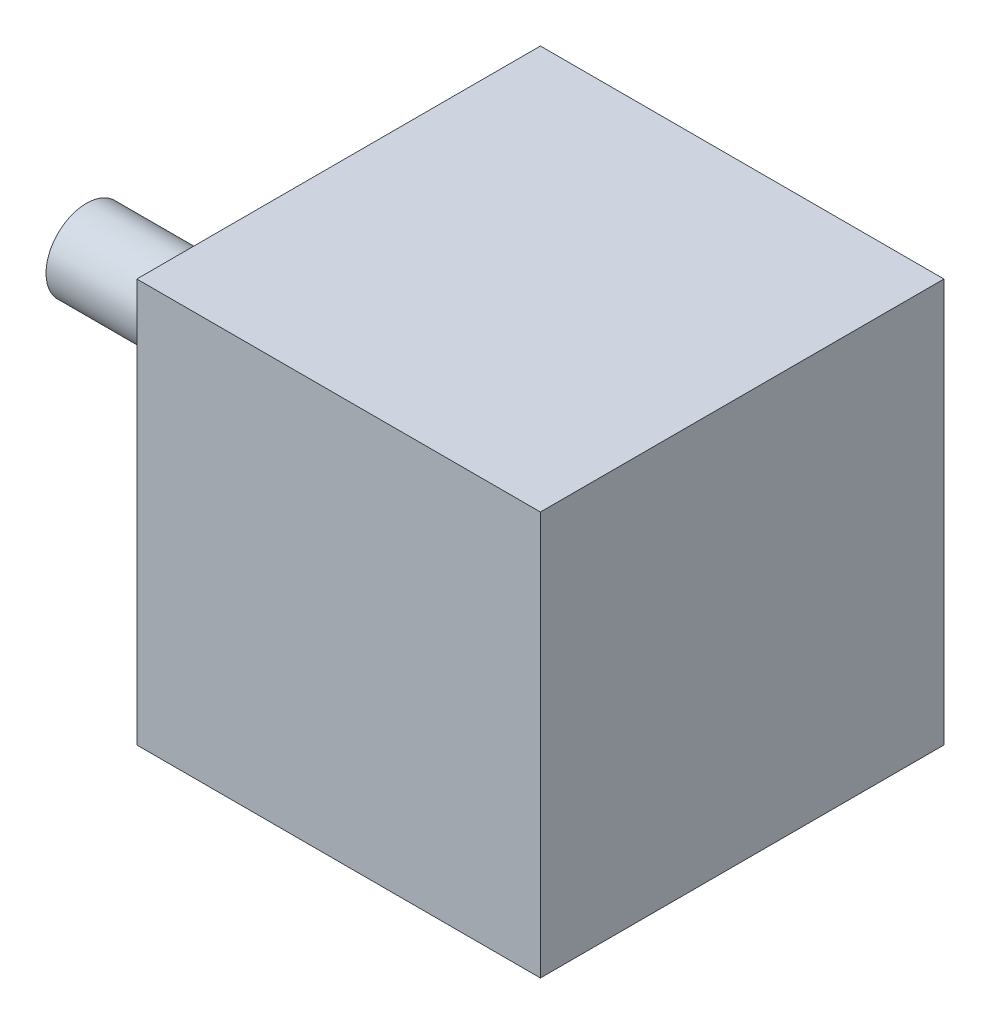
ISO-10303-21;
HEADER;
FILE_DESCRIPTION(('STEP AP214'),'2;1');
FILE_NAME('part.step','',(''),(''),'','','');
FILE_SCHEMA(('AUTOMOTIVE_DESIGN { 1 0 10303 214 1 1 1 1 }'));
ENDSEC;
DATA;
#1=APPLICATION_CONTEXT('core data for automotive mechanical design processes');
#2=APPLICATION_PROTOCOL_DEFINITION('international standard','automotive_design',2000,#1);
#3=PRODUCT_CONTEXT('',#1,'mechanical');
#4=PRODUCT('Part','Part','',(#3));
#5=PRODUCT_RELATED_PRODUCT_CATEGORY('part','',(#4));
#6=PRODUCT_DEFINITION_FORMATION('','',#4);
#7=PRODUCT_DEFINITION_CONTEXT('part definition',#1,'design');
#8=PRODUCT_DEFINITION('design','',#6,#7);
#9=PRODUCT_DEFINITION_SHAPE('','',#8);
#10=(LENGTH_UNIT() NAMED_UNIT(*) SI_UNIT(.MILLI.,.METRE.));
#11=(NAMED_UNIT(*) PLANE_ANGLE_UNIT() SI_UNIT($,.RADIAN.));
#12=(NAMED_UNIT(*) SI_UNIT($,.STERADIAN.) SOLID_ANGLE_UNIT());
#13=UNCERTAINTY_MEASURE_WITH_UNIT(LENGTH_MEASURE(1.E-05),#10,'distance_accuracy_value','');
#14=(GEOMETRIC_REPRESENTATION_CONTEXT(3) GLOBAL_UNCERTAINTY_ASSIGNED_CONTEXT((#13)) GLOBAL_UNIT_ASSIGNED_CONTEXT((#10,
#11,#12)) REPRESENTATION_CONTEXT('',''));
#15=CARTESIAN_POINT('',(0.,0.,0.));
#16=DIRECTION('',(0.,0.,1.));
#17=DIRECTION('',(1.,0.,0.));
#18=AXIS2_PLACEMENT_3D('',#15,#16,#17);
#19=CARTESIAN_POINT('',(-20.,20.,40.));
#20=DIRECTION('',(0.,-1.,0.));
#21=DIRECTION('',(1.,0.,0.));
#22=AXIS2_PLACEMENT_3D('',#19,#20,#21);
#23=PLANE('',#22);
#24=DIRECTION('',(-1.,0.,0.));
#25=VECTOR('',#24,1.);
#26=CARTESIAN_POINT('',(-20.,20.,0.));
#27=LINE('',#26,#25);
#28=CARTESIAN_POINT('',(20.,20.,0.));
#29=VERTEX_POINT('',#28);
#30=CARTESIAN_POINT('',(-20.,20.,0.));
#31=VERTEX_POINT('',#30);
#32=EDGE_CURVE('E105',#29,#31,#27,.T.);
#33=ORIENTED_EDGE('',*,*,#32,.T.);
#34=DIRECTION('',(0.,0.,-1.));
#35=VECTOR('',#34,1.);
#36=CARTESIAN_POINT('',(-20.,20.,40.));
#37=LINE('',#36,#35);
#38=CARTESIAN_POINT('',(-20.,20.,40.));
#39=VERTEX_POINT('',#38);
#40=EDGE_CURVE('E47',#39,#31,#37,.T.);
#41=ORIENTED_EDGE('',*,*,#40,.F.);
#42=DIRECTION('',(-1.,0.,0.));
#43=VECTOR('',#42,1.);
#44=CARTESIAN_POINT('',(-20.,20.,40.));
#45=LINE('',#44,#43);
#46=CARTESIAN_POINT('',(20.,20.,40.));
#47=VERTEX_POINT('',#46);
#48=EDGE_CURVE('E91',#47,#39,#45,.T.);
#49=ORIENTED_EDGE('',*,*,#48,.F.);
#50=DIRECTION('',(0.,0.,-1.));
#51=VECTOR('',#50,1.);
#52=CARTESIAN_POINT('',(20.,20.,40.));
#53=LINE('',#52,#51);
#54=EDGE_CURVE('E101',#47,#29,#53,.T.);
#55=ORIENTED_EDGE('',*,*,#54,.T.);
#56=EDGE_LOOP('',(#33,#41,#49,#55));
#57=FACE_BOUND('',#56,.T.);
#58=ADVANCED_FACE('F39',(#57),#23,.F.);
#59=CARTESIAN_POINT('',(-20.,-20.,40.));
#60=DIRECTION('',(1.,0.,0.));
#61=DIRECTION('',(0.,0.,-1.));
#62=AXIS2_PLACEMENT_3D('',#59,#60,#61);
#63=PLANE('',#62);
#64=CARTESIAN_POINT('',(-20.,0.,20.));
#65=DIRECTION('',(1.,0.,0.));
#66=DIRECTION('',(0.,0.,-1.));
#67=AXIS2_PLACEMENT_3D('',#64,#65,#66);
#68=CIRCLE('',#67,4.);
#69=CARTESIAN_POINT('',(-20.,0.,16.));
#70=VERTEX_POINT('',#69);
#71=EDGE_CURVE('E11',#70,#70,#68,.F.);
#72=ORIENTED_EDGE('',*,*,#71,.F.);
#73=EDGE_LOOP('',(#72));
#74=FACE_BOUND('',#73,.T.);
#75=DIRECTION('',(0.,-1.,0.));
#76=VECTOR('',#75,1.);
#77=CARTESIAN_POINT('',(-20.,-20.,0.));
#78=LINE('',#77,#76);
#79=CARTESIAN_POINT('',(-20.,-20.,0.));
#80=VERTEX_POINT('',#79);
#81=EDGE_CURVE('E96',#31,#80,#78,.T.);
#82=ORIENTED_EDGE('',*,*,#81,.T.);
#83=DIRECTION('',(0.,0.,-1.));
#84=VECTOR('',#83,1.);
#85=CARTESIAN_POINT('',(-20.,-20.,40.));
#86=LINE('',#85,#84);
#87=CARTESIAN_POINT('',(-20.,-20.,40.));
#88=VERTEX_POINT('',#87);
#89=EDGE_CURVE('E94',#88,#80,#86,.T.);
#90=ORIENTED_EDGE('',*,*,#89,.F.);
#91=DIRECTION('',(0.,-1.,0.));
#92=VECTOR('',#91,1.);
#93=CARTESIAN_POINT('',(-20.,-20.,40.));
#94=LINE('',#93,#92);
#95=EDGE_CURVE('E86',#39,#88,#94,.T.);
#96=ORIENTED_EDGE('',*,*,#95,.F.);
#97=ORIENTED_EDGE('',*,*,#40,.T.);
#98=EDGE_LOOP('',(#82,#90,#96,#97));
#99=FACE_BOUND('',#98,.T.);
#100=ADVANCED_FACE('F95',(#74,#99),#63,.F.);
#101=CARTESIAN_POINT('',(-20.,-20.,40.));
#102=DIRECTION('',(0.,1.,0.));
#103=DIRECTION('',(-1.,0.,0.));
#104=AXIS2_PLACEMENT_3D('',#101,#102,#103);
#105=PLANE('',#104);
#106=DIRECTION('',(1.,0.,0.));
#107=VECTOR('',#106,1.);
#108=CARTESIAN_POINT('',(-20.,-20.,0.));
#109=LINE('',#108,#107);
#110=CARTESIAN_POINT('',(20.,-20.,0.));
#111=VERTEX_POINT('',#110);
#112=EDGE_CURVE('E72',#80,#111,#109,.T.);
#113=ORIENTED_EDGE('',*,*,#112,.T.);
#114=DIRECTION('',(0.,0.,-1.));
#115=VECTOR('',#114,1.);
#116=CARTESIAN_POINT('',(20.,-20.,40.));
#117=LINE('',#116,#115);
#118=CARTESIAN_POINT('',(20.,-20.,40.));
#119=VERTEX_POINT('',#118);
#120=EDGE_CURVE('E97',#119,#111,#117,.T.);
#121=ORIENTED_EDGE('',*,*,#120,.F.);
#122=DIRECTION('',(1.,0.,0.));
#123=VECTOR('',#122,1.);
#124=CARTESIAN_POINT('',(-20.,-20.,40.));
#125=LINE('',#124,#123);
#126=EDGE_CURVE('E89',#88,#119,#125,.T.);
#127=ORIENTED_EDGE('',*,*,#126,.F.);
#128=ORIENTED_EDGE('',*,*,#89,.T.);
#129=EDGE_LOOP('',(#113,#121,#127,#128));
#130=FACE_BOUND('',#129,.T.);
#131=ADVANCED_FACE('F99',(#130),#105,.F.);
#132=CARTESIAN_POINT('',(20.,-20.,40.));
#133=DIRECTION('',(-1.,0.,0.));
#134=DIRECTION('',(0.,0.,1.));
#135=AXIS2_PLACEMENT_3D('',#132,#133,#134);
#136=PLANE('',#135);
#137=DIRECTION('',(0.,1.,0.));
#138=VECTOR('',#137,1.);
#139=CARTESIAN_POINT('',(20.,-20.,0.));
#140=LINE('',#139,#138);
#141=EDGE_CURVE('E78',#111,#29,#140,.T.);
#142=ORIENTED_EDGE('',*,*,#141,.T.);
#143=ORIENTED_EDGE('',*,*,#54,.F.);
#144=DIRECTION('',(0.,1.,0.));
#145=VECTOR('',#144,1.);
#146=CARTESIAN_POINT('',(20.,-20.,40.));
#147=LINE('',#146,#145);
#148=EDGE_CURVE('E55',#119,#47,#147,.T.);
#149=ORIENTED_EDGE('',*,*,#148,.F.);
#150=ORIENTED_EDGE('',*,*,#120,.T.);
#151=EDGE_LOOP('',(#142,#143,#149,#150));
#152=FACE_BOUND('',#151,.T.);
#153=ADVANCED_FACE('F128',(#152),#136,.F.);
#154=CARTESIAN_POINT('',(0.,0.,40.));
#155=DIRECTION('',(0.,0.,1.));
#156=DIRECTION('',(1.,0.,0.));
#157=AXIS2_PLACEMENT_3D('',#154,#155,#156);
#158=PLANE('',#157);
#159=ORIENTED_EDGE('',*,*,#48,.T.);
#160=ORIENTED_EDGE('',*,*,#95,.T.);
#161=ORIENTED_EDGE('',*,*,#126,.T.);
#162=ORIENTED_EDGE('',*,*,#148,.T.);
#163=EDGE_LOOP('',(#159,#160,#161,#162));
#164=FACE_BOUND('',#163,.T.);
#165=ADVANCED_FACE('F87',(#164),#158,.T.);
#166=CARTESIAN_POINT('',(0.,0.,0.));
#167=DIRECTION('',(0.,0.,1.));
#168=DIRECTION('',(1.,0.,0.));
#169=AXIS2_PLACEMENT_3D('',#166,#167,#168);
#170=PLANE('',#169);
#171=ORIENTED_EDGE('',*,*,#32,.F.);
#172=ORIENTED_EDGE('',*,*,#141,.F.);
#173=ORIENTED_EDGE('',*,*,#112,.F.);
#174=ORIENTED_EDGE('',*,*,#81,.F.);
#175=EDGE_LOOP('',(#171,#172,#173,#174));
#176=FACE_BOUND('',#175,.T.);
#177=ADVANCED_FACE('F116',(#176),#170,.F.);
#178=CARTESIAN_POINT('',(-45.,0.,20.));
#179=DIRECTION('',(1.,0.,0.));
#180=DIRECTION('',(0.,0.,-1.));
#181=AXIS2_PLACEMENT_3D('',#178,#179,#180);
#182=CYLINDRICAL_SURFACE('',#181,4.);
#183=CARTESIAN_POINT('',(-45.,0.,20.));
#184=DIRECTION('',(-1.,0.,0.));
#185=DIRECTION('',(0.,0.,1.));
#186=AXIS2_PLACEMENT_3D('',#183,#184,#185);
#187=CIRCLE('',#186,4.);
#188=CARTESIAN_POINT('',(-45.,0.,24.));
#189=VERTEX_POINT('',#188);
#190=EDGE_CURVE('E108',#189,#189,#187,.T.);
#191=ORIENTED_EDGE('',*,*,#190,.F.);
#192=EDGE_LOOP('',(#191));
#193=FACE_BOUND('',#192,.T.);
#194=ORIENTED_EDGE('',*,*,#71,.T.);
#195=EDGE_LOOP('',(#194));
#196=FACE_BOUND('',#195,.T.);
#197=ADVANCED_FACE('F118',(#193,#196),#182,.T.);
#198=CARTESIAN_POINT('',(-45.,0.,20.));
#199=DIRECTION('',(-1.,0.,0.));
#200=DIRECTION('',(0.,0.,1.));
#201=AXIS2_PLACEMENT_3D('',#198,#199,#200);
#202=PLANE('',#201);
#203=ORIENTED_EDGE('',*,*,#190,.T.);
#204=EDGE_LOOP('',(#203));
#205=FACE_BOUND('',#204,.T.);
#206=ADVANCED_FACE('F125',(#205),#202,.T.);
#207=CLOSED_SHELL('',(#58,#100,#131,#153,#165,#177,#197,#206));
#208=MANIFOLD_SOLID_BREP('B2',#207);
#209=ADVANCED_BREP_SHAPE_REPRESENTATION('',(#18,#208),#14);
#210=SHAPE_DEFINITION_REPRESENTATION(#9,#209);
ENDSEC;
END-ISO-10303-21;
